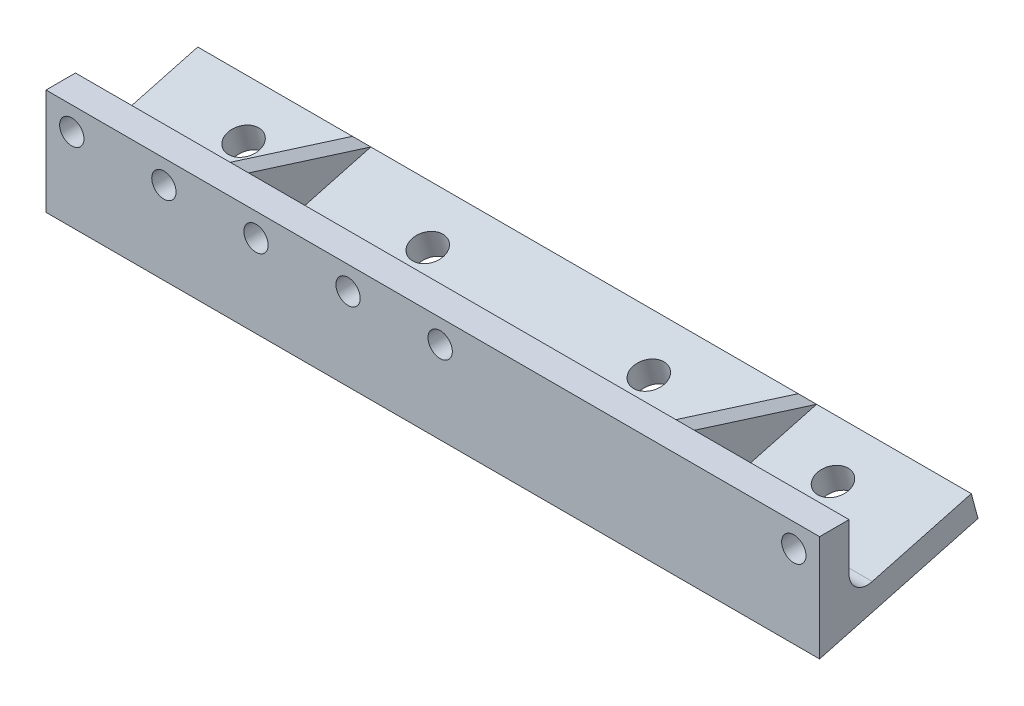
ISO-10303-21;
HEADER;
FILE_DESCRIPTION(('STEP AP214'),'2;1');
FILE_NAME('part.step','',(''),(''),'','','');
FILE_SCHEMA(('AUTOMOTIVE_DESIGN { 1 0 10303 214 1 1 1 1 }'));
ENDSEC;
DATA;
#1=APPLICATION_CONTEXT('core data for automotive mechanical design processes');
#2=APPLICATION_PROTOCOL_DEFINITION('international standard','automotive_design',2000,#1);
#3=PRODUCT_CONTEXT('',#1,'mechanical');
#4=PRODUCT('Part','Part','',(#3));
#5=PRODUCT_RELATED_PRODUCT_CATEGORY('part','',(#4));
#6=PRODUCT_DEFINITION_FORMATION('','',#4);
#7=PRODUCT_DEFINITION_CONTEXT('part definition',#1,'design');
#8=PRODUCT_DEFINITION('design','',#6,#7);
#9=PRODUCT_DEFINITION_SHAPE('','',#8);
#10=(LENGTH_UNIT() NAMED_UNIT(*) SI_UNIT(.MILLI.,.METRE.));
#11=(NAMED_UNIT(*) PLANE_ANGLE_UNIT() SI_UNIT($,.RADIAN.));
#12=(NAMED_UNIT(*) SI_UNIT($,.STERADIAN.) SOLID_ANGLE_UNIT());
#13=UNCERTAINTY_MEASURE_WITH_UNIT(LENGTH_MEASURE(1.E-05),#10,'distance_accuracy_value','');
#14=(GEOMETRIC_REPRESENTATION_CONTEXT(3) GLOBAL_UNCERTAINTY_ASSIGNED_CONTEXT((#13)) GLOBAL_UNIT_ASSIGNED_CONTEXT((#10,
#11,#12)) REPRESENTATION_CONTEXT('',''));
#15=CARTESIAN_POINT('',(0.,0.,0.));
#16=DIRECTION('',(0.,0.,1.));
#17=DIRECTION('',(1.,0.,0.));
#18=AXIS2_PLACEMENT_3D('',#15,#16,#17);
#19=CARTESIAN_POINT('',(158.,10.6217782649107,-60.));
#20=DIRECTION('',(0.,0.,1.));
#21=DIRECTION('',(1.,0.,0.));
#22=AXIS2_PLACEMENT_3D('',#19,#20,#21);
#23=PLANE('',#22);
#24=CARTESIAN_POINT('',(5.00000000000002,23.65,-60.));
#25=DIRECTION('',(0.,0.,-1.));
#26=DIRECTION('',(-1.,0.,0.));
#27=AXIS2_PLACEMENT_3D('',#24,#25,#26);
#28=CIRCLE('',#27,3.3);
#29=CARTESIAN_POINT('',(1.70000000000002,23.65,-60.));
#30=VERTEX_POINT('',#29);
#31=EDGE_CURVE('E202',#30,#30,#28,.T.);
#32=ORIENTED_EDGE('',*,*,#31,.F.);
#33=EDGE_LOOP('',(#32));
#34=FACE_BOUND('',#33,.T.);
#35=CARTESIAN_POINT('',(30.,23.65,-60.));
#36=DIRECTION('',(0.,0.,-1.));
#37=DIRECTION('',(-1.,0.,0.));
#38=AXIS2_PLACEMENT_3D('',#35,#36,#37);
#39=CIRCLE('',#38,3.3);
#40=CARTESIAN_POINT('',(26.7,23.65,-60.));
#41=VERTEX_POINT('',#40);
#42=EDGE_CURVE('E208',#41,#41,#39,.T.);
#43=ORIENTED_EDGE('',*,*,#42,.F.);
#44=EDGE_LOOP('',(#43));
#45=FACE_BOUND('',#44,.T.);
#46=CARTESIAN_POINT('',(55.,23.65,-60.));
#47=DIRECTION('',(0.,0.,-1.));
#48=DIRECTION('',(-1.,0.,0.));
#49=AXIS2_PLACEMENT_3D('',#46,#47,#48);
#50=CIRCLE('',#49,3.3);
#51=CARTESIAN_POINT('',(51.7,23.65,-60.));
#52=VERTEX_POINT('',#51);
#53=EDGE_CURVE('E179',#52,#52,#50,.T.);
#54=ORIENTED_EDGE('',*,*,#53,.F.);
#55=EDGE_LOOP('',(#54));
#56=FACE_BOUND('',#55,.T.);
#57=DIRECTION('',(0.,-1.,0.));
#58=VECTOR('',#57,1.);
#59=CARTESIAN_POINT('',(111.,30.,-60.));
#60=LINE('',#59,#58);
#61=CARTESIAN_POINT('',(111.,30.,-60.));
#62=VERTEX_POINT('',#61);
#63=CARTESIAN_POINT('',(111.,17.1379051291167,-60.));
#64=VERTEX_POINT('',#63);
#65=EDGE_CURVE('E227',#62,#64,#60,.T.);
#66=ORIENTED_EDGE('',*,*,#65,.T.);
#67=DIRECTION('',(-1.,0.,0.));
#68=VECTOR('',#67,1.);
#69=CARTESIAN_POINT('',(-52.,17.1379051291167,-60.));
#70=LINE('',#69,#68);
#71=CARTESIAN_POINT('',(-4.99999999999998,17.1379051291167,-60.));
#72=VERTEX_POINT('',#71);
#73=EDGE_CURVE('E354',#64,#72,#70,.T.);
#74=ORIENTED_EDGE('',*,*,#73,.T.);
#75=DIRECTION('',(0.,1.,0.));
#76=VECTOR('',#75,1.);
#77=CARTESIAN_POINT('',(-4.99999999999999,17.1379051291167,-60.));
#78=LINE('',#77,#76);
#79=CARTESIAN_POINT('',(-4.99999999999998,30.,-60.));
#80=VERTEX_POINT('',#79);
#81=EDGE_CURVE('E265',#72,#80,#78,.T.);
#82=ORIENTED_EDGE('',*,*,#81,.T.);
#83=DIRECTION('',(-1.,0.,0.));
#84=VECTOR('',#83,1.);
#85=CARTESIAN_POINT('',(158.,30.,-60.));
#86=LINE('',#85,#84);
#87=EDGE_CURVE('E335',#62,#80,#86,.T.);
#88=ORIENTED_EDGE('',*,*,#87,.F.);
#89=EDGE_LOOP('',(#66,#74,#82,#88));
#90=FACE_BOUND('',#89,.T.);
#91=ADVANCED_FACE('F43',(#34,#45,#56,#90),#23,.F.);
#92=CARTESIAN_POINT('',(158.,20.,-95.));
#93=DIRECTION('',(0.,-0.965925826289068,-0.258819045102521));
#94=DIRECTION('',(0.,0.258819045102521,-0.965925826289068));
#95=AXIS2_PLACEMENT_3D('',#92,#93,#94);
#96=PLANE('',#95);
#97=CARTESIAN_POINT('',(23.,16.1498999348201,-80.6312309425245));
#98=DIRECTION('',(0.,0.965925826289068,0.258819045102521));
#99=DIRECTION('',(0.,-0.258819045102521,0.965925826289068));
#100=AXIS2_PLACEMENT_3D('',#97,#98,#99);
#101=CIRCLE('',#100,4.25000000000001);
#102=CARTESIAN_POINT('',(23.,15.0499189931344,-76.5260461807959));
#103=VERTEX_POINT('',#102);
#104=EDGE_CURVE('E288',#103,#103,#101,.T.);
#105=ORIENTED_EDGE('',*,*,#104,.F.);
#106=EDGE_LOOP('',(#105));
#107=FACE_BOUND('',#106,.T.);
#108=CARTESIAN_POINT('',(83.,16.1498999348201,-80.6312309425245));
#109=DIRECTION('',(0.,0.965925826289068,0.258819045102521));
#110=DIRECTION('',(0.,-0.258819045102521,0.965925826289068));
#111=AXIS2_PLACEMENT_3D('',#108,#109,#110);
#112=CIRCLE('',#111,4.25000000000001);
#113=CARTESIAN_POINT('',(83.,15.0499189931344,-76.5260461807959));
#114=VERTEX_POINT('',#113);
#115=EDGE_CURVE('E292',#114,#114,#112,.T.);
#116=ORIENTED_EDGE('',*,*,#115,.F.);
#117=EDGE_LOOP('',(#116));
#118=FACE_BOUND('',#117,.T.);
#119=DIRECTION('',(0.,0.258819045102521,-0.965925826289068));
#120=VECTOR('',#119,1.);
#121=CARTESIAN_POINT('',(111.,12.3082759976714,-66.2940952255126));
#122=LINE('',#121,#120);
#123=CARTESIAN_POINT('',(111.,12.3082759976714,-66.2940952255126));
#124=VERTEX_POINT('',#123);
#125=CARTESIAN_POINT('',(111.,19.5145475211529,-93.1882666842824));
#126=VERTEX_POINT('',#125);
#127=EDGE_CURVE('E237',#124,#126,#122,.T.);
#128=ORIENTED_EDGE('',*,*,#127,.T.);
#129=DIRECTION('',(-1.,0.,0.));
#130=VECTOR('',#129,1.);
#131=CARTESIAN_POINT('',(158.,19.5145475211529,-93.1882666842824));
#132=LINE('',#131,#130);
#133=CARTESIAN_POINT('',(-4.99999999999998,19.5145475211529,-93.1882666842824));
#134=VERTEX_POINT('',#133);
#135=EDGE_CURVE('E310',#126,#134,#132,.T.);
#136=ORIENTED_EDGE('',*,*,#135,.T.);
#137=DIRECTION('',(0.,-0.258819045102521,0.965925826289068));
#138=VECTOR('',#137,1.);
#139=CARTESIAN_POINT('',(-4.99999999999999,19.5145475211529,-93.1882666842824));
#140=LINE('',#139,#138);
#141=CARTESIAN_POINT('',(-4.99999999999998,12.3082759976714,-66.2940952255126));
#142=VERTEX_POINT('',#141);
#143=EDGE_CURVE('E254',#134,#142,#140,.T.);
#144=ORIENTED_EDGE('',*,*,#143,.T.);
#145=DIRECTION('',(-1.,0.,0.));
#146=VECTOR('',#145,1.);
#147=CARTESIAN_POINT('',(158.,12.3082759976714,-66.2940952255126));
#148=LINE('',#147,#146);
#149=EDGE_CURVE('E53',#142,#124,#148,.F.);
#150=ORIENTED_EDGE('',*,*,#149,.T.);
#151=EDGE_LOOP('',(#128,#136,#144,#150));
#152=FACE_BOUND('',#151,.T.);
#153=ADVANCED_FACE('F392',(#107,#118,#152),#96,.F.);
#154=CARTESIAN_POINT('',(158.,17.1379051291167,-65.));
#155=DIRECTION('',(1.,0.,0.));
#156=DIRECTION('',(0.,0.,-1.));
#157=AXIS2_PLACEMENT_3D('',#154,#155,#156);
#158=CYLINDRICAL_SURFACE('',#157,5.);
#159=CARTESIAN_POINT('',(111.,17.1379051291167,-65.));
#160=DIRECTION('',(1.,0.,0.));
#161=DIRECTION('',(0.,0.,-1.));
#162=AXIS2_PLACEMENT_3D('',#159,#160,#161);
#163=CIRCLE('',#162,5.);
#164=EDGE_CURVE('E70',#64,#124,#163,.T.);
#165=ORIENTED_EDGE('',*,*,#164,.T.);
#166=ORIENTED_EDGE('',*,*,#149,.F.);
#167=CARTESIAN_POINT('',(-4.99999999999999,17.1379051291167,-65.));
#168=DIRECTION('',(-1.,0.,0.));
#169=DIRECTION('',(0.,0.,1.));
#170=AXIS2_PLACEMENT_3D('',#167,#168,#169);
#171=CIRCLE('',#170,5.);
#172=EDGE_CURVE('E251',#142,#72,#171,.T.);
#173=ORIENTED_EDGE('',*,*,#172,.T.);
#174=ORIENTED_EDGE('',*,*,#73,.F.);
#175=EDGE_LOOP('',(#165,#166,#173,#174));
#176=FACE_BOUND('',#175,.T.);
#177=ADVANCED_FACE('F402',(#176),#158,.F.);
#178=CARTESIAN_POINT('',(151.,23.65,-60.));
#179=DIRECTION('',(0.,0.,-1.));
#180=DIRECTION('',(-1.,0.,0.));
#181=AXIS2_PLACEMENT_3D('',#178,#179,#180);
#182=CIRCLE('',#181,3.3);
#183=CARTESIAN_POINT('',(147.7,23.65,-60.));
#184=VERTEX_POINT('',#183);
#185=EDGE_CURVE('E184',#184,#184,#182,.T.);
#186=ORIENTED_EDGE('',*,*,#185,.F.);
#187=EDGE_LOOP('',(#186));
#188=FACE_BOUND('',#187,.T.);
#189=CARTESIAN_POINT('',(158.,17.1379051291167,-60.));
#190=VERTEX_POINT('',#189);
#191=CARTESIAN_POINT('',(116.,17.1379051291167,-60.));
#192=VERTEX_POINT('',#191);
#193=EDGE_CURVE('E351',#190,#192,#70,.T.);
#194=ORIENTED_EDGE('',*,*,#193,.T.);
#195=DIRECTION('',(0.,-1.,0.));
#196=VECTOR('',#195,1.);
#197=CARTESIAN_POINT('',(116.,30.,-60.));
#198=LINE('',#197,#196);
#199=CARTESIAN_POINT('',(116.,30.,-60.));
#200=VERTEX_POINT('',#199);
#201=EDGE_CURVE('E232',#200,#192,#198,.T.);
#202=ORIENTED_EDGE('',*,*,#201,.F.);
#203=CARTESIAN_POINT('',(158.,30.,-60.));
#204=VERTEX_POINT('',#203);
#205=EDGE_CURVE('E339',#204,#200,#86,.T.);
#206=ORIENTED_EDGE('',*,*,#205,.F.);
#207=DIRECTION('',(0.,1.,0.));
#208=VECTOR('',#207,1.);
#209=CARTESIAN_POINT('',(158.,17.1379051291167,-60.));
#210=LINE('',#209,#208);
#211=EDGE_CURVE('E218',#190,#204,#210,.T.);
#212=ORIENTED_EDGE('',*,*,#211,.F.);
#213=EDGE_LOOP('',(#194,#202,#206,#212));
#214=FACE_BOUND('',#213,.T.);
#215=ADVANCED_FACE('F395',(#188,#214),#23,.F.);
#216=CARTESIAN_POINT('',(133.,16.1498999348201,-80.6312309425245));
#217=DIRECTION('',(0.,0.965925826289068,0.258819045102521));
#218=DIRECTION('',(0.,-0.258819045102521,0.965925826289068));
#219=AXIS2_PLACEMENT_3D('',#216,#217,#218);
#220=CIRCLE('',#219,4.25000000000001);
#221=CARTESIAN_POINT('',(133.,15.0499189931344,-76.5260461807959));
#222=VERTEX_POINT('',#221);
#223=EDGE_CURVE('E282',#222,#222,#220,.T.);
#224=ORIENTED_EDGE('',*,*,#223,.F.);
#225=EDGE_LOOP('',(#224));
#226=FACE_BOUND('',#225,.T.);
#227=CARTESIAN_POINT('',(158.,19.5145475211529,-93.1882666842824));
#228=VERTEX_POINT('',#227);
#229=CARTESIAN_POINT('',(116.,19.5145475211529,-93.1882666842824));
#230=VERTEX_POINT('',#229);
#231=EDGE_CURVE('E313',#228,#230,#132,.T.);
#232=ORIENTED_EDGE('',*,*,#231,.T.);
#233=DIRECTION('',(0.,0.258819045102521,-0.965925826289068));
#234=VECTOR('',#233,1.);
#235=CARTESIAN_POINT('',(116.,12.3082759976714,-66.2940952255126));
#236=LINE('',#235,#234);
#237=CARTESIAN_POINT('',(116.,12.3082759976714,-66.2940952255126));
#238=VERTEX_POINT('',#237);
#239=EDGE_CURVE('E62',#238,#230,#236,.T.);
#240=ORIENTED_EDGE('',*,*,#239,.F.);
#241=CARTESIAN_POINT('',(158.,12.3082759976714,-66.2940952255126));
#242=VERTEX_POINT('',#241);
#243=EDGE_CURVE('E55',#238,#242,#148,.F.);
#244=ORIENTED_EDGE('',*,*,#243,.T.);
#245=DIRECTION('',(0.,-0.258819045102521,0.965925826289068));
#246=VECTOR('',#245,1.);
#247=CARTESIAN_POINT('',(158.,19.5145475211529,-93.1882666842824));
#248=LINE('',#247,#246);
#249=EDGE_CURVE('E221',#228,#242,#248,.T.);
#250=ORIENTED_EDGE('',*,*,#249,.F.);
#251=EDGE_LOOP('',(#232,#240,#244,#250));
#252=FACE_BOUND('',#251,.T.);
#253=ADVANCED_FACE('F405',(#226,#252),#96,.F.);
#254=ORIENTED_EDGE('',*,*,#243,.F.);
#255=CARTESIAN_POINT('',(116.,17.1379051291167,-65.));
#256=DIRECTION('',(1.,0.,0.));
#257=DIRECTION('',(0.,0.,-1.));
#258=AXIS2_PLACEMENT_3D('',#255,#256,#257);
#259=CIRCLE('',#258,5.);
#260=EDGE_CURVE('E224',#192,#238,#259,.T.);
#261=ORIENTED_EDGE('',*,*,#260,.F.);
#262=ORIENTED_EDGE('',*,*,#193,.F.);
#263=CARTESIAN_POINT('',(158.,17.1379051291167,-65.));
#264=DIRECTION('',(-1.,0.,0.));
#265=DIRECTION('',(0.,0.,1.));
#266=AXIS2_PLACEMENT_3D('',#263,#264,#265);
#267=CIRCLE('',#266,5.);
#268=EDGE_CURVE('E183',#242,#190,#267,.T.);
#269=ORIENTED_EDGE('',*,*,#268,.F.);
#270=EDGE_LOOP('',(#254,#261,#262,#269));
#271=FACE_BOUND('',#270,.T.);
#272=ADVANCED_FACE('F412',(#271),#158,.F.);
#273=CARTESIAN_POINT('',(-45.,23.65,-60.));
#274=DIRECTION('',(0.,0.,-1.));
#275=DIRECTION('',(-1.,0.,0.));
#276=AXIS2_PLACEMENT_3D('',#273,#274,#275);
#277=CIRCLE('',#276,3.3);
#278=CARTESIAN_POINT('',(-48.3,23.65,-60.));
#279=VERTEX_POINT('',#278);
#280=EDGE_CURVE('E190',#279,#279,#277,.T.);
#281=ORIENTED_EDGE('',*,*,#280,.F.);
#282=EDGE_LOOP('',(#281));
#283=FACE_BOUND('',#282,.T.);
#284=CARTESIAN_POINT('',(-20.,23.65,-60.));
#285=DIRECTION('',(0.,0.,-1.));
#286=DIRECTION('',(-1.,0.,0.));
#287=AXIS2_PLACEMENT_3D('',#284,#285,#286);
#288=CIRCLE('',#287,3.3);
#289=CARTESIAN_POINT('',(-23.3,23.65,-60.));
#290=VERTEX_POINT('',#289);
#291=EDGE_CURVE('E196',#290,#290,#288,.T.);
#292=ORIENTED_EDGE('',*,*,#291,.F.);
#293=EDGE_LOOP('',(#292));
#294=FACE_BOUND('',#293,.T.);
#295=CARTESIAN_POINT('',(-9.99999999999998,17.1379051291167,-60.));
#296=VERTEX_POINT('',#295);
#297=CARTESIAN_POINT('',(-52.,17.1379051291167,-60.));
#298=VERTEX_POINT('',#297);
#299=EDGE_CURVE('E350',#296,#298,#70,.T.);
#300=ORIENTED_EDGE('',*,*,#299,.T.);
#301=DIRECTION('',(0.,-1.,0.));
#302=VECTOR('',#301,1.);
#303=CARTESIAN_POINT('',(-52.,30.,-60.));
#304=LINE('',#303,#302);
#305=CARTESIAN_POINT('',(-52.,30.,-60.));
#306=VERTEX_POINT('',#305);
#307=EDGE_CURVE('E172',#306,#298,#304,.T.);
#308=ORIENTED_EDGE('',*,*,#307,.F.);
#309=DIRECTION('',(-1.,0.,0.));
#310=VECTOR('',#309,1.);
#311=CARTESIAN_POINT('',(-47.,30.,-60.));
#312=LINE('',#311,#310);
#313=CARTESIAN_POINT('',(-9.99999999999998,30.,-60.));
#314=VERTEX_POINT('',#313);
#315=EDGE_CURVE('E302',#314,#306,#312,.T.);
#316=ORIENTED_EDGE('',*,*,#315,.F.);
#317=DIRECTION('',(0.,1.,0.));
#318=VECTOR('',#317,1.);
#319=CARTESIAN_POINT('',(-9.99999999999998,17.1379051291167,-60.));
#320=LINE('',#319,#318);
#321=EDGE_CURVE('E253',#296,#314,#320,.T.);
#322=ORIENTED_EDGE('',*,*,#321,.F.);
#323=EDGE_LOOP('',(#300,#308,#316,#322));
#324=FACE_BOUND('',#323,.T.);
#325=ADVANCED_FACE('F396',(#283,#294,#324),#23,.F.);
#326=CARTESIAN_POINT('',(-27.,16.1498999348201,-80.6312309425245));
#327=DIRECTION('',(0.,0.965925826289068,0.258819045102521));
#328=DIRECTION('',(0.,-0.258819045102521,0.965925826289068));
#329=AXIS2_PLACEMENT_3D('',#326,#327,#328);
#330=CIRCLE('',#329,4.25000000000001);
#331=CARTESIAN_POINT('',(-27.,15.0499189931344,-76.5260461807959));
#332=VERTEX_POINT('',#331);
#333=EDGE_CURVE('E283',#332,#332,#330,.T.);
#334=ORIENTED_EDGE('',*,*,#333,.F.);
#335=EDGE_LOOP('',(#334));
#336=FACE_BOUND('',#335,.T.);
#337=CARTESIAN_POINT('',(-52.,12.3082759976714,-66.2940952255126));
#338=VERTEX_POINT('',#337);
#339=CARTESIAN_POINT('',(-9.99999999999998,12.3082759976714,-66.2940952255126));
#340=VERTEX_POINT('',#339);
#341=EDGE_CURVE('E11',#338,#340,#148,.F.);
#342=ORIENTED_EDGE('',*,*,#341,.T.);
#343=DIRECTION('',(0.,-0.258819045102521,0.965925826289068));
#344=VECTOR('',#343,1.);
#345=CARTESIAN_POINT('',(-9.99999999999998,19.5145475211529,-93.1882666842824));
#346=LINE('',#345,#344);
#347=CARTESIAN_POINT('',(-9.99999999999998,19.5145475211529,-93.1882666842824));
#348=VERTEX_POINT('',#347);
#349=EDGE_CURVE('E260',#348,#340,#346,.T.);
#350=ORIENTED_EDGE('',*,*,#349,.F.);
#351=DIRECTION('',(-1.,0.,0.));
#352=VECTOR('',#351,1.);
#353=CARTESIAN_POINT('',(-47.,19.5145475211529,-93.1882666842824));
#354=LINE('',#353,#352);
#355=CARTESIAN_POINT('',(-52.,19.5145475211529,-93.1882666842824));
#356=VERTEX_POINT('',#355);
#357=EDGE_CURVE('E168',#348,#356,#354,.T.);
#358=ORIENTED_EDGE('',*,*,#357,.T.);
#359=DIRECTION('',(0.,0.258819045102521,-0.965925826289068));
#360=VECTOR('',#359,1.);
#361=CARTESIAN_POINT('',(-52.,12.3082759976714,-66.2940952255126));
#362=LINE('',#361,#360);
#363=EDGE_CURVE('E166',#338,#356,#362,.T.);
#364=ORIENTED_EDGE('',*,*,#363,.F.);
#365=EDGE_LOOP('',(#342,#350,#358,#364));
#366=FACE_BOUND('',#365,.T.);
#367=ADVANCED_FACE('F167',(#336,#366),#96,.F.);
#368=ORIENTED_EDGE('',*,*,#299,.F.);
#369=CARTESIAN_POINT('',(-9.99999999999998,17.1379051291167,-65.));
#370=DIRECTION('',(-1.,0.,0.));
#371=DIRECTION('',(0.,0.,1.));
#372=AXIS2_PLACEMENT_3D('',#369,#370,#371);
#373=CIRCLE('',#372,5.);
#374=EDGE_CURVE('E161',#340,#296,#373,.T.);
#375=ORIENTED_EDGE('',*,*,#374,.F.);
#376=ORIENTED_EDGE('',*,*,#341,.F.);
#377=CARTESIAN_POINT('',(-52.,17.1379051291167,-65.));
#378=DIRECTION('',(1.,0.,0.));
#379=DIRECTION('',(0.,0.,-1.));
#380=AXIS2_PLACEMENT_3D('',#377,#378,#379);
#381=CIRCLE('',#380,5.);
#382=EDGE_CURVE('E158',#298,#338,#381,.T.);
#383=ORIENTED_EDGE('',*,*,#382,.F.);
#384=EDGE_LOOP('',(#368,#375,#376,#383));
#385=FACE_BOUND('',#384,.T.);
#386=ADVANCED_FACE('F45',(#385),#158,.F.);
#387=CARTESIAN_POINT('',(160.,30.,-31.93));
#388=DIRECTION('',(0.,1.,0.));
#389=DIRECTION('',(0.,0.,1.));
#390=AXIS2_PLACEMENT_3D('',#387,#388,#389);
#391=PLANE('',#390);
#392=DIRECTION('',(-1.,0.,0.));
#393=VECTOR('',#392,1.);
#394=CARTESIAN_POINT('',(160.,30.,-52.));
#395=LINE('',#394,#393);
#396=CARTESIAN_POINT('',(158.,30.,-52.));
#397=VERTEX_POINT('',#396);
#398=CARTESIAN_POINT('',(-52.,30.,-52.));
#399=VERTEX_POINT('',#398);
#400=EDGE_CURVE('E279',#397,#399,#395,.T.);
#401=ORIENTED_EDGE('',*,*,#400,.F.);
#402=DIRECTION('',(0.,0.,1.));
#403=VECTOR('',#402,1.);
#404=CARTESIAN_POINT('',(158.,30.,0.));
#405=LINE('',#404,#403);
#406=EDGE_CURVE('E346',#204,#397,#405,.T.);
#407=ORIENTED_EDGE('',*,*,#406,.F.);
#408=ORIENTED_EDGE('',*,*,#205,.T.);
#409=DIRECTION('',(-1.,0.,0.));
#410=VECTOR('',#409,1.);
#411=CARTESIAN_POINT('',(116.,30.,-60.));
#412=LINE('',#411,#410);
#413=EDGE_CURVE('E235',#200,#62,#412,.T.);
#414=ORIENTED_EDGE('',*,*,#413,.T.);
#415=ORIENTED_EDGE('',*,*,#87,.T.);
#416=DIRECTION('',(1.,0.,0.));
#417=VECTOR('',#416,1.);
#418=CARTESIAN_POINT('',(-9.99999999999998,30.,-60.));
#419=LINE('',#418,#417);
#420=EDGE_CURVE('E275',#314,#80,#419,.T.);
#421=ORIENTED_EDGE('',*,*,#420,.F.);
#422=ORIENTED_EDGE('',*,*,#315,.T.);
#423=DIRECTION('',(0.,0.,1.));
#424=VECTOR('',#423,1.);
#425=CARTESIAN_POINT('',(-52.,30.,0.));
#426=LINE('',#425,#424);
#427=EDGE_CURVE('E342',#306,#399,#426,.T.);
#428=ORIENTED_EDGE('',*,*,#427,.T.);
#429=EDGE_LOOP('',(#401,#407,#408,#414,#415,#421,#422,#428));
#430=FACE_BOUND('',#429,.T.);
#431=ADVANCED_FACE('F441',(#430),#391,.T.);
#432=CARTESIAN_POINT('',(158.,0.,0.));
#433=DIRECTION('',(-1.,0.,0.));
#434=DIRECTION('',(0.,0.,1.));
#435=AXIS2_PLACEMENT_3D('',#432,#433,#434);
#436=PLANE('',#435);
#437=DIRECTION('',(0.,0.965925826289068,0.25881904510252));
#438=VECTOR('',#437,1.);
#439=CARTESIAN_POINT('',(158.,12.7530667371294,-95.));
#440=LINE('',#439,#438);
#441=CARTESIAN_POINT('',(158.,12.7530667371294,-95.));
#442=VERTEX_POINT('',#441);
#443=EDGE_CURVE('E306',#442,#228,#440,.T.);
#444=ORIENTED_EDGE('',*,*,#443,.T.);
#445=ORIENTED_EDGE('',*,*,#249,.T.);
#446=ORIENTED_EDGE('',*,*,#268,.T.);
#447=ORIENTED_EDGE('',*,*,#211,.T.);
#448=ORIENTED_EDGE('',*,*,#406,.T.);
#449=DIRECTION('',(0.,-1.,0.));
#450=VECTOR('',#449,1.);
#451=CARTESIAN_POINT('',(158.,17.3,-52.));
#452=LINE('',#451,#450);
#453=CARTESIAN_POINT('',(158.,1.2312514625911,-52.));
#454=VERTEX_POINT('',#453);
#455=EDGE_CURVE('E317',#397,#454,#452,.T.);
#456=ORIENTED_EDGE('',*,*,#455,.T.);
#457=DIRECTION('',(0.,0.258819045102521,-0.965925826289068));
#458=VECTOR('',#457,1.);
#459=CARTESIAN_POINT('',(158.,12.7530667371294,-95.));
#460=LINE('',#459,#458);
#461=EDGE_CURVE('E324',#454,#442,#460,.T.);
#462=ORIENTED_EDGE('',*,*,#461,.T.);
#463=EDGE_LOOP('',(#444,#445,#446,#447,#448,#456,#462));
#464=FACE_BOUND('',#463,.T.);
#465=ADVANCED_FACE('F499',(#464),#436,.F.);
#466=CARTESIAN_POINT('',(-52.,0.,0.));
#467=DIRECTION('',(-1.,0.,0.));
#468=DIRECTION('',(0.,0.,1.));
#469=AXIS2_PLACEMENT_3D('',#466,#467,#468);
#470=PLANE('',#469);
#471=ORIENTED_EDGE('',*,*,#307,.T.);
#472=ORIENTED_EDGE('',*,*,#382,.T.);
#473=ORIENTED_EDGE('',*,*,#363,.T.);
#474=DIRECTION('',(0.,0.965925826289068,0.25881904510252));
#475=VECTOR('',#474,1.);
#476=CARTESIAN_POINT('',(-52.,12.7530667371294,-95.));
#477=LINE('',#476,#475);
#478=CARTESIAN_POINT('',(-52.,12.7530667371294,-95.));
#479=VERTEX_POINT('',#478);
#480=EDGE_CURVE('E301',#479,#356,#477,.T.);
#481=ORIENTED_EDGE('',*,*,#480,.F.);
#482=DIRECTION('',(0.,0.258819045102521,-0.965925826289068));
#483=VECTOR('',#482,1.);
#484=CARTESIAN_POINT('',(-52.,12.7530667371294,-95.));
#485=LINE('',#484,#483);
#486=CARTESIAN_POINT('',(-52.,1.2312514625911,-52.));
#487=VERTEX_POINT('',#486);
#488=EDGE_CURVE('E321',#487,#479,#485,.T.);
#489=ORIENTED_EDGE('',*,*,#488,.F.);
#490=DIRECTION('',(0.,-1.,0.));
#491=VECTOR('',#490,1.);
#492=CARTESIAN_POINT('',(-52.,17.3,-52.));
#493=LINE('',#492,#491);
#494=EDGE_CURVE('E316',#399,#487,#493,.T.);
#495=ORIENTED_EDGE('',*,*,#494,.F.);
#496=ORIENTED_EDGE('',*,*,#427,.F.);
#497=EDGE_LOOP('',(#471,#472,#473,#481,#489,#495,#496));
#498=FACE_BOUND('',#497,.T.);
#499=ADVANCED_FACE('F174',(#498),#470,.T.);
#500=CARTESIAN_POINT('',(158.,12.7530667371294,-95.));
#501=DIRECTION('',(0.,0.965925826289068,0.258819045102521));
#502=DIRECTION('',(0.,-0.258819045102521,0.965925826289068));
#503=AXIS2_PLACEMENT_3D('',#500,#501,#502);
#504=PLANE('',#503);
#505=CARTESIAN_POINT('',(-27.,9.38841915079663,-82.4429642582421));
#506=DIRECTION('',(0.,0.965925826289068,0.258819045102521));
#507=DIRECTION('',(0.,-0.258819045102521,0.965925826289068));
#508=AXIS2_PLACEMENT_3D('',#505,#506,#507);
#509=CIRCLE('',#508,4.25000000000001);
#510=CARTESIAN_POINT('',(-27.,8.28843820911091,-78.3377794965136));
#511=VERTEX_POINT('',#510);
#512=EDGE_CURVE('E47',#511,#511,#509,.T.);
#513=ORIENTED_EDGE('',*,*,#512,.T.);
#514=EDGE_LOOP('',(#513));
#515=FACE_BOUND('',#514,.T.);
#516=CARTESIAN_POINT('',(23.,9.38841915079663,-82.4429642582421));
#517=DIRECTION('',(0.,0.965925826289068,0.258819045102521));
#518=DIRECTION('',(0.,-0.258819045102521,0.965925826289068));
#519=AXIS2_PLACEMENT_3D('',#516,#517,#518);
#520=CIRCLE('',#519,4.25000000000001);
#521=CARTESIAN_POINT('',(23.,8.28843820911091,-78.3377794965136));
#522=VERTEX_POINT('',#521);
#523=EDGE_CURVE('E362',#522,#522,#520,.T.);
#524=ORIENTED_EDGE('',*,*,#523,.T.);
#525=EDGE_LOOP('',(#524));
#526=FACE_BOUND('',#525,.T.);
#527=CARTESIAN_POINT('',(83.,9.38841915079663,-82.4429642582421));
#528=DIRECTION('',(0.,0.965925826289068,0.258819045102521));
#529=DIRECTION('',(0.,-0.258819045102521,0.965925826289068));
#530=AXIS2_PLACEMENT_3D('',#527,#528,#529);
#531=CIRCLE('',#530,4.25000000000001);
#532=CARTESIAN_POINT('',(83.,8.28843820911091,-78.3377794965136));
#533=VERTEX_POINT('',#532);
#534=EDGE_CURVE('E359',#533,#533,#531,.T.);
#535=ORIENTED_EDGE('',*,*,#534,.T.);
#536=EDGE_LOOP('',(#535));
#537=FACE_BOUND('',#536,.T.);
#538=CARTESIAN_POINT('',(133.,9.38841915079663,-82.4429642582421));
#539=DIRECTION('',(0.,0.965925826289068,0.258819045102521));
#540=DIRECTION('',(0.,-0.258819045102521,0.965925826289068));
#541=AXIS2_PLACEMENT_3D('',#538,#539,#540);
#542=CIRCLE('',#541,4.25000000000001);
#543=CARTESIAN_POINT('',(133.,8.28843820911091,-78.3377794965136));
#544=VERTEX_POINT('',#543);
#545=EDGE_CURVE('E287',#544,#544,#542,.T.);
#546=ORIENTED_EDGE('',*,*,#545,.T.);
#547=EDGE_LOOP('',(#546));
#548=FACE_BOUND('',#547,.T.);
#549=ORIENTED_EDGE('',*,*,#488,.T.);
#550=DIRECTION('',(-1.,0.,0.));
#551=VECTOR('',#550,1.);
#552=CARTESIAN_POINT('',(158.,12.7530667371294,-95.));
#553=LINE('',#552,#551);
#554=EDGE_CURVE('E332',#442,#479,#553,.T.);
#555=ORIENTED_EDGE('',*,*,#554,.F.);
#556=ORIENTED_EDGE('',*,*,#461,.F.);
#557=DIRECTION('',(-1.,0.,0.));
#558=VECTOR('',#557,1.);
#559=CARTESIAN_POINT('',(158.,1.2312514625911,-52.));
#560=LINE('',#559,#558);
#561=EDGE_CURVE('E328',#454,#487,#560,.T.);
#562=ORIENTED_EDGE('',*,*,#561,.T.);
#563=EDGE_LOOP('',(#549,#555,#556,#562));
#564=FACE_BOUND('',#563,.T.);
#565=ADVANCED_FACE('F372',(#515,#526,#537,#548,#564),#504,.F.);
#566=CARTESIAN_POINT('',(158.,17.3,-52.));
#567=DIRECTION('',(0.,0.,-1.));
#568=DIRECTION('',(-1.,0.,0.));
#569=AXIS2_PLACEMENT_3D('',#566,#567,#568);
#570=PLANE('',#569);
#571=CARTESIAN_POINT('',(151.,23.65,-52.));
#572=DIRECTION('',(0.,0.,-1.));
#573=DIRECTION('',(-1.,0.,0.));
#574=AXIS2_PLACEMENT_3D('',#571,#572,#573);
#575=CIRCLE('',#574,3.3);
#576=CARTESIAN_POINT('',(147.7,23.65,-52.));
#577=VERTEX_POINT('',#576);
#578=EDGE_CURVE('E180',#577,#577,#575,.T.);
#579=ORIENTED_EDGE('',*,*,#578,.T.);
#580=EDGE_LOOP('',(#579));
#581=FACE_BOUND('',#580,.T.);
#582=CARTESIAN_POINT('',(-45.,23.65,-52.));
#583=DIRECTION('',(0.,0.,-1.));
#584=DIRECTION('',(-1.,0.,0.));
#585=AXIS2_PLACEMENT_3D('',#582,#583,#584);
#586=CIRCLE('',#585,3.3);
#587=CARTESIAN_POINT('',(-48.3,23.65,-52.));
#588=VERTEX_POINT('',#587);
#589=EDGE_CURVE('E187',#588,#588,#586,.T.);
#590=ORIENTED_EDGE('',*,*,#589,.T.);
#591=EDGE_LOOP('',(#590));
#592=FACE_BOUND('',#591,.T.);
#593=CARTESIAN_POINT('',(-20.,23.65,-52.));
#594=DIRECTION('',(0.,0.,-1.));
#595=DIRECTION('',(-1.,0.,0.));
#596=AXIS2_PLACEMENT_3D('',#593,#594,#595);
#597=CIRCLE('',#596,3.3);
#598=CARTESIAN_POINT('',(-23.3,23.65,-52.));
#599=VERTEX_POINT('',#598);
#600=EDGE_CURVE('E193',#599,#599,#597,.T.);
#601=ORIENTED_EDGE('',*,*,#600,.T.);
#602=EDGE_LOOP('',(#601));
#603=FACE_BOUND('',#602,.T.);
#604=CARTESIAN_POINT('',(5.00000000000002,23.65,-52.));
#605=DIRECTION('',(0.,0.,-1.));
#606=DIRECTION('',(-1.,0.,0.));
#607=AXIS2_PLACEMENT_3D('',#604,#605,#606);
#608=CIRCLE('',#607,3.3);
#609=CARTESIAN_POINT('',(1.70000000000002,23.65,-52.));
#610=VERTEX_POINT('',#609);
#611=EDGE_CURVE('E199',#610,#610,#608,.T.);
#612=ORIENTED_EDGE('',*,*,#611,.T.);
#613=EDGE_LOOP('',(#612));
#614=FACE_BOUND('',#613,.T.);
#615=CARTESIAN_POINT('',(30.,23.65,-52.));
#616=DIRECTION('',(0.,0.,-1.));
#617=DIRECTION('',(-1.,0.,0.));
#618=AXIS2_PLACEMENT_3D('',#615,#616,#617);
#619=CIRCLE('',#618,3.3);
#620=CARTESIAN_POINT('',(26.7,23.65,-52.));
#621=VERTEX_POINT('',#620);
#622=EDGE_CURVE('E205',#621,#621,#619,.T.);
#623=ORIENTED_EDGE('',*,*,#622,.T.);
#624=EDGE_LOOP('',(#623));
#625=FACE_BOUND('',#624,.T.);
#626=CARTESIAN_POINT('',(55.,23.65,-52.));
#627=DIRECTION('',(0.,0.,-1.));
#628=DIRECTION('',(-1.,0.,0.));
#629=AXIS2_PLACEMENT_3D('',#626,#627,#628);
#630=CIRCLE('',#629,3.3);
#631=CARTESIAN_POINT('',(51.7,23.65,-52.));
#632=VERTEX_POINT('',#631);
#633=EDGE_CURVE('E211',#632,#632,#630,.T.);
#634=ORIENTED_EDGE('',*,*,#633,.T.);
#635=EDGE_LOOP('',(#634));
#636=FACE_BOUND('',#635,.T.);
#637=ORIENTED_EDGE('',*,*,#455,.F.);
#638=ORIENTED_EDGE('',*,*,#400,.T.);
#639=ORIENTED_EDGE('',*,*,#494,.T.);
#640=ORIENTED_EDGE('',*,*,#561,.F.);
#641=EDGE_LOOP('',(#637,#638,#639,#640));
#642=FACE_BOUND('',#641,.T.);
#643=ADVANCED_FACE('F511',(#581,#592,#603,#614,#625,#636,#642),#570,.F.);
#644=CARTESIAN_POINT('',(158.,12.7530667371294,-95.));
#645=DIRECTION('',(0.,-0.25881904510252,0.965925826289068));
#646=DIRECTION('',(0.,-0.965925826289068,-0.25881904510252));
#647=AXIS2_PLACEMENT_3D('',#644,#645,#646);
#648=PLANE('',#647);
#649=ORIENTED_EDGE('',*,*,#480,.T.);
#650=ORIENTED_EDGE('',*,*,#357,.F.);
#651=DIRECTION('',(1.,0.,0.));
#652=VECTOR('',#651,1.);
#653=CARTESIAN_POINT('',(-9.99999999999998,19.5145475211529,-93.1882666842824));
#654=LINE('',#653,#652);
#655=EDGE_CURVE('E262',#348,#134,#654,.T.);
#656=ORIENTED_EDGE('',*,*,#655,.T.);
#657=ORIENTED_EDGE('',*,*,#135,.F.);
#658=DIRECTION('',(-1.,0.,0.));
#659=VECTOR('',#658,1.);
#660=CARTESIAN_POINT('',(116.,19.5145475211529,-93.1882666842824));
#661=LINE('',#660,#659);
#662=EDGE_CURVE('E247',#230,#126,#661,.T.);
#663=ORIENTED_EDGE('',*,*,#662,.F.);
#664=ORIENTED_EDGE('',*,*,#231,.F.);
#665=ORIENTED_EDGE('',*,*,#443,.F.);
#666=ORIENTED_EDGE('',*,*,#554,.T.);
#667=EDGE_LOOP('',(#649,#650,#656,#657,#663,#664,#665,#666));
#668=FACE_BOUND('',#667,.T.);
#669=ADVANCED_FACE('F505',(#668),#648,.F.);
#670=CARTESIAN_POINT('',(133.,-2.51035410302427,-85.6312309425245));
#671=DIRECTION('',(0.,0.965925826289068,0.258819045102521));
#672=DIRECTION('',(0.,-0.258819045102521,0.965925826289068));
#673=AXIS2_PLACEMENT_3D('',#670,#671,#672);
#674=CYLINDRICAL_SURFACE('',#673,4.25000000000001);
#675=ORIENTED_EDGE('',*,*,#223,.T.);
#676=EDGE_LOOP('',(#675));
#677=FACE_BOUND('',#676,.T.);
#678=ORIENTED_EDGE('',*,*,#545,.F.);
#679=EDGE_LOOP('',(#678));
#680=FACE_BOUND('',#679,.T.);
#681=ADVANCED_FACE('F526',(#677,#680),#674,.F.);
#682=CARTESIAN_POINT('',(83.,-2.51035410302427,-85.6312309425245));
#683=DIRECTION('',(0.,0.965925826289068,0.258819045102521));
#684=DIRECTION('',(0.,-0.258819045102521,0.965925826289068));
#685=AXIS2_PLACEMENT_3D('',#682,#683,#684);
#686=CYLINDRICAL_SURFACE('',#685,4.25000000000001);
#687=ORIENTED_EDGE('',*,*,#115,.T.);
#688=EDGE_LOOP('',(#687));
#689=FACE_BOUND('',#688,.T.);
#690=ORIENTED_EDGE('',*,*,#534,.F.);
#691=EDGE_LOOP('',(#690));
#692=FACE_BOUND('',#691,.T.);
#693=ADVANCED_FACE('F388',(#689,#692),#686,.F.);
#694=CARTESIAN_POINT('',(23.,-2.51035410302427,-85.6312309425245));
#695=DIRECTION('',(0.,0.965925826289068,0.258819045102521));
#696=DIRECTION('',(0.,-0.258819045102521,0.965925826289068));
#697=AXIS2_PLACEMENT_3D('',#694,#695,#696);
#698=CYLINDRICAL_SURFACE('',#697,4.25000000000001);
#699=ORIENTED_EDGE('',*,*,#104,.T.);
#700=EDGE_LOOP('',(#699));
#701=FACE_BOUND('',#700,.T.);
#702=ORIENTED_EDGE('',*,*,#523,.F.);
#703=EDGE_LOOP('',(#702));
#704=FACE_BOUND('',#703,.T.);
#705=ADVANCED_FACE('F377',(#701,#704),#698,.F.);
#706=CARTESIAN_POINT('',(-27.,-2.51035410302427,-85.6312309425245));
#707=DIRECTION('',(0.,0.965925826289068,0.258819045102521));
#708=DIRECTION('',(0.,-0.258819045102521,0.965925826289068));
#709=AXIS2_PLACEMENT_3D('',#706,#707,#708);
#710=CYLINDRICAL_SURFACE('',#709,4.25000000000001);
#711=ORIENTED_EDGE('',*,*,#333,.T.);
#712=EDGE_LOOP('',(#711));
#713=FACE_BOUND('',#712,.T.);
#714=ORIENTED_EDGE('',*,*,#512,.F.);
#715=EDGE_LOOP('',(#714));
#716=FACE_BOUND('',#715,.T.);
#717=ADVANCED_FACE('F374',(#713,#716),#710,.F.);
#718=CARTESIAN_POINT('',(-9.99999999999998,30.,-60.));
#719=DIRECTION('',(0.,-0.95354184042704,0.301260615671901));
#720=DIRECTION('',(0.,-0.301260615671901,-0.95354184042704));
#721=AXIS2_PLACEMENT_3D('',#718,#719,#720);
#722=PLANE('',#721);
#723=DIRECTION('',(0.,-0.301260615671901,-0.95354184042704));
#724=VECTOR('',#723,1.);
#725=CARTESIAN_POINT('',(-4.99999999999999,30.,-60.));
#726=LINE('',#725,#724);
#727=EDGE_CURVE('E268',#80,#134,#726,.T.);
#728=ORIENTED_EDGE('',*,*,#727,.T.);
#729=ORIENTED_EDGE('',*,*,#655,.F.);
#730=DIRECTION('',(0.,-0.301260615671901,-0.95354184042704));
#731=VECTOR('',#730,1.);
#732=CARTESIAN_POINT('',(-9.99999999999998,30.,-60.));
#733=LINE('',#732,#731);
#734=EDGE_CURVE('E257',#314,#348,#733,.T.);
#735=ORIENTED_EDGE('',*,*,#734,.F.);
#736=ORIENTED_EDGE('',*,*,#420,.T.);
#737=EDGE_LOOP('',(#728,#729,#735,#736));
#738=FACE_BOUND('',#737,.T.);
#739=ADVANCED_FACE('F376',(#738),#722,.F.);
#740=CARTESIAN_POINT('',(-9.99999999999998,17.1379051291167,-65.));
#741=DIRECTION('',(-1.,0.,0.));
#742=DIRECTION('',(0.,0.,1.));
#743=AXIS2_PLACEMENT_3D('',#740,#741,#742);
#744=PLANE('',#743);
#745=ORIENTED_EDGE('',*,*,#374,.T.);
#746=ORIENTED_EDGE('',*,*,#321,.T.);
#747=ORIENTED_EDGE('',*,*,#734,.T.);
#748=ORIENTED_EDGE('',*,*,#349,.T.);
#749=EDGE_LOOP('',(#745,#746,#747,#748));
#750=FACE_BOUND('',#749,.T.);
#751=ADVANCED_FACE('F385',(#750),#744,.T.);
#752=CARTESIAN_POINT('',(-4.99999999999999,17.1379051291167,-65.));
#753=DIRECTION('',(-1.,0.,0.));
#754=DIRECTION('',(0.,0.,1.));
#755=AXIS2_PLACEMENT_3D('',#752,#753,#754);
#756=PLANE('',#755);
#757=ORIENTED_EDGE('',*,*,#172,.F.);
#758=ORIENTED_EDGE('',*,*,#143,.F.);
#759=ORIENTED_EDGE('',*,*,#727,.F.);
#760=ORIENTED_EDGE('',*,*,#81,.F.);
#761=EDGE_LOOP('',(#757,#758,#759,#760));
#762=FACE_BOUND('',#761,.T.);
#763=ADVANCED_FACE('F435',(#762),#756,.F.);
#764=CARTESIAN_POINT('',(116.,19.5145475211529,-93.1882666842824));
#765=DIRECTION('',(0.,-0.95354184042704,0.301260615671901));
#766=DIRECTION('',(0.,-0.301260615671901,-0.95354184042704));
#767=AXIS2_PLACEMENT_3D('',#764,#765,#766);
#768=PLANE('',#767);
#769=DIRECTION('',(0.,0.301260615671901,0.95354184042704));
#770=VECTOR('',#769,1.);
#771=CARTESIAN_POINT('',(111.,19.5145475211529,-93.1882666842824));
#772=LINE('',#771,#770);
#773=EDGE_CURVE('E240',#126,#62,#772,.T.);
#774=ORIENTED_EDGE('',*,*,#773,.T.);
#775=ORIENTED_EDGE('',*,*,#413,.F.);
#776=DIRECTION('',(0.,0.301260615671901,0.95354184042704));
#777=VECTOR('',#776,1.);
#778=CARTESIAN_POINT('',(116.,19.5145475211529,-93.1882666842824));
#779=LINE('',#778,#777);
#780=EDGE_CURVE('E229',#230,#200,#779,.T.);
#781=ORIENTED_EDGE('',*,*,#780,.F.);
#782=ORIENTED_EDGE('',*,*,#662,.T.);
#783=EDGE_LOOP('',(#774,#775,#781,#782));
#784=FACE_BOUND('',#783,.T.);
#785=ADVANCED_FACE('F448',(#784),#768,.F.);
#786=CARTESIAN_POINT('',(116.,17.1379051291167,-65.));
#787=DIRECTION('',(1.,0.,0.));
#788=DIRECTION('',(0.,0.,-1.));
#789=AXIS2_PLACEMENT_3D('',#786,#787,#788);
#790=PLANE('',#789);
#791=ORIENTED_EDGE('',*,*,#260,.T.);
#792=ORIENTED_EDGE('',*,*,#239,.T.);
#793=ORIENTED_EDGE('',*,*,#780,.T.);
#794=ORIENTED_EDGE('',*,*,#201,.T.);
#795=EDGE_LOOP('',(#791,#792,#793,#794));
#796=FACE_BOUND('',#795,.T.);
#797=ADVANCED_FACE('F453',(#796),#790,.T.);
#798=CARTESIAN_POINT('',(111.,17.1379051291167,-65.));
#799=DIRECTION('',(1.,0.,0.));
#800=DIRECTION('',(0.,0.,-1.));
#801=AXIS2_PLACEMENT_3D('',#798,#799,#800);
#802=PLANE('',#801);
#803=ORIENTED_EDGE('',*,*,#164,.F.);
#804=ORIENTED_EDGE('',*,*,#65,.F.);
#805=ORIENTED_EDGE('',*,*,#773,.F.);
#806=ORIENTED_EDGE('',*,*,#127,.F.);
#807=EDGE_LOOP('',(#803,#804,#805,#806));
#808=FACE_BOUND('',#807,.T.);
#809=ADVANCED_FACE('F455',(#808),#802,.F.);
#810=CARTESIAN_POINT('',(-45.,23.65,-52.));
#811=DIRECTION('',(0.,0.,-1.));
#812=DIRECTION('',(-1.,0.,0.));
#813=AXIS2_PLACEMENT_3D('',#810,#811,#812);
#814=CYLINDRICAL_SURFACE('',#813,3.3);
#815=ORIENTED_EDGE('',*,*,#589,.F.);
#816=EDGE_LOOP('',(#815));
#817=FACE_BOUND('',#816,.T.);
#818=ORIENTED_EDGE('',*,*,#280,.T.);
#819=EDGE_LOOP('',(#818));
#820=FACE_BOUND('',#819,.T.);
#821=ADVANCED_FACE('F458',(#817,#820),#814,.F.);
#822=CARTESIAN_POINT('',(55.,23.65,-52.));
#823=DIRECTION('',(0.,0.,-1.));
#824=DIRECTION('',(-1.,0.,0.));
#825=AXIS2_PLACEMENT_3D('',#822,#823,#824);
#826=CYLINDRICAL_SURFACE('',#825,3.3);
#827=ORIENTED_EDGE('',*,*,#633,.F.);
#828=EDGE_LOOP('',(#827));
#829=FACE_BOUND('',#828,.T.);
#830=ORIENTED_EDGE('',*,*,#53,.T.);
#831=EDGE_LOOP('',(#830));
#832=FACE_BOUND('',#831,.T.);
#833=ADVANCED_FACE('F463',(#829,#832),#826,.F.);
#834=CARTESIAN_POINT('',(30.,23.65,-52.));
#835=DIRECTION('',(0.,0.,-1.));
#836=DIRECTION('',(-1.,0.,0.));
#837=AXIS2_PLACEMENT_3D('',#834,#835,#836);
#838=CYLINDRICAL_SURFACE('',#837,3.3);
#839=ORIENTED_EDGE('',*,*,#622,.F.);
#840=EDGE_LOOP('',(#839));
#841=FACE_BOUND('',#840,.T.);
#842=ORIENTED_EDGE('',*,*,#42,.T.);
#843=EDGE_LOOP('',(#842));
#844=FACE_BOUND('',#843,.T.);
#845=ADVANCED_FACE('F466',(#841,#844),#838,.F.);
#846=CARTESIAN_POINT('',(5.00000000000002,23.65,-52.));
#847=DIRECTION('',(0.,0.,-1.));
#848=DIRECTION('',(-1.,0.,0.));
#849=AXIS2_PLACEMENT_3D('',#846,#847,#848);
#850=CYLINDRICAL_SURFACE('',#849,3.3);
#851=ORIENTED_EDGE('',*,*,#611,.F.);
#852=EDGE_LOOP('',(#851));
#853=FACE_BOUND('',#852,.T.);
#854=ORIENTED_EDGE('',*,*,#31,.T.);
#855=EDGE_LOOP('',(#854));
#856=FACE_BOUND('',#855,.T.);
#857=ADVANCED_FACE('F470',(#853,#856),#850,.F.);
#858=CARTESIAN_POINT('',(-20.,23.65,-52.));
#859=DIRECTION('',(0.,0.,-1.));
#860=DIRECTION('',(-1.,0.,0.));
#861=AXIS2_PLACEMENT_3D('',#858,#859,#860);
#862=CYLINDRICAL_SURFACE('',#861,3.3);
#863=ORIENTED_EDGE('',*,*,#600,.F.);
#864=EDGE_LOOP('',(#863));
#865=FACE_BOUND('',#864,.T.);
#866=ORIENTED_EDGE('',*,*,#291,.T.);
#867=EDGE_LOOP('',(#866));
#868=FACE_BOUND('',#867,.T.);
#869=ADVANCED_FACE('F474',(#865,#868),#862,.F.);
#870=CARTESIAN_POINT('',(151.,23.65,-52.));
#871=DIRECTION('',(0.,0.,-1.));
#872=DIRECTION('',(-1.,0.,0.));
#873=AXIS2_PLACEMENT_3D('',#870,#871,#872);
#874=CYLINDRICAL_SURFACE('',#873,3.3);
#875=ORIENTED_EDGE('',*,*,#578,.F.);
#876=EDGE_LOOP('',(#875));
#877=FACE_BOUND('',#876,.T.);
#878=ORIENTED_EDGE('',*,*,#185,.T.);
#879=EDGE_LOOP('',(#878));
#880=FACE_BOUND('',#879,.T.);
#881=ADVANCED_FACE('F478',(#877,#880),#874,.F.);
#882=CLOSED_SHELL('',(#91,#153,#177,#215,#253,#272,#325,#367,#386,#431,#465,#499,#565,#643,#669,
#681,#693,#705,#717,#739,#751,#763,#785,#797,#809,#821,#833,#845,#857,#869,#881));
#883=MANIFOLD_SOLID_BREP('B2',#882);
#884=ADVANCED_BREP_SHAPE_REPRESENTATION('',(#18,#883),#14);
#885=SHAPE_DEFINITION_REPRESENTATION(#9,#884);
ENDSEC;
END-ISO-10303-21;
